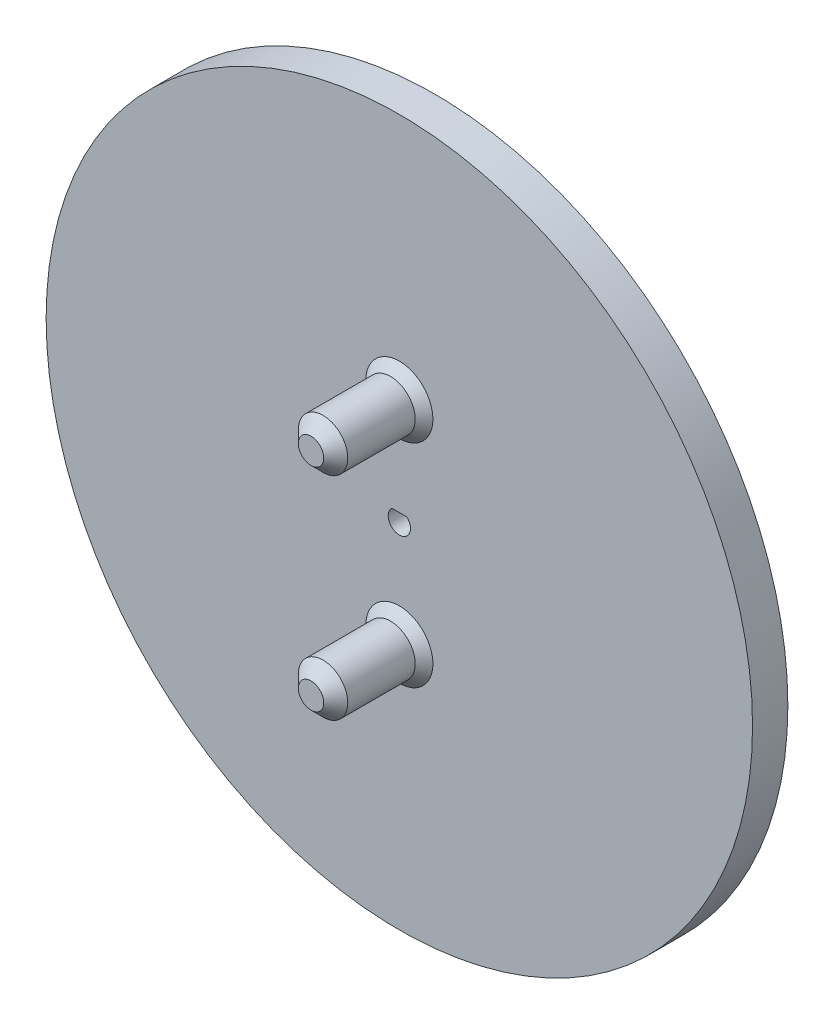
ISO-10303-21;
HEADER;
FILE_DESCRIPTION(('STEP AP214'),'2;1');
FILE_NAME('part.step','',(''),(''),'','','');
FILE_SCHEMA(('AUTOMOTIVE_DESIGN { 1 0 10303 214 1 1 1 1 }'));
ENDSEC;
DATA;
#1=APPLICATION_CONTEXT('core data for automotive mechanical design processes');
#2=APPLICATION_PROTOCOL_DEFINITION('international standard','automotive_design',2000,#1);
#3=PRODUCT_CONTEXT('',#1,'mechanical');
#4=PRODUCT('Part','Part','',(#3));
#5=PRODUCT_RELATED_PRODUCT_CATEGORY('part','',(#4));
#6=PRODUCT_DEFINITION_FORMATION('','',#4);
#7=PRODUCT_DEFINITION_CONTEXT('part definition',#1,'design');
#8=PRODUCT_DEFINITION('design','',#6,#7);
#9=PRODUCT_DEFINITION_SHAPE('','',#8);
#10=(LENGTH_UNIT() NAMED_UNIT(*) SI_UNIT(.MILLI.,.METRE.));
#11=(NAMED_UNIT(*) PLANE_ANGLE_UNIT() SI_UNIT($,.RADIAN.));
#12=(NAMED_UNIT(*) SI_UNIT($,.STERADIAN.) SOLID_ANGLE_UNIT());
#13=UNCERTAINTY_MEASURE_WITH_UNIT(LENGTH_MEASURE(1.E-05),#10,'distance_accuracy_value','');
#14=(GEOMETRIC_REPRESENTATION_CONTEXT(3) GLOBAL_UNCERTAINTY_ASSIGNED_CONTEXT((#13)) GLOBAL_UNIT_ASSIGNED_CONTEXT((#10,
#11,#12)) REPRESENTATION_CONTEXT('',''));
#15=CARTESIAN_POINT('',(0.,0.,0.));
#16=DIRECTION('',(0.,0.,1.));
#17=DIRECTION('',(1.,0.,0.));
#18=AXIS2_PLACEMENT_3D('',#15,#16,#17);
#19=CARTESIAN_POINT('',(0.,0.,6.35));
#20=DIRECTION('',(0.,0.,-1.));
#21=DIRECTION('',(-1.,0.,0.));
#22=AXIS2_PLACEMENT_3D('',#19,#20,#21);
#23=CYLINDRICAL_SURFACE('',#22,63.5);
#24=CARTESIAN_POINT('',(0.,0.,6.35));
#25=DIRECTION('',(0.,0.,1.));
#26=DIRECTION('',(1.,0.,0.));
#27=AXIS2_PLACEMENT_3D('',#24,#25,#26);
#28=CIRCLE('',#27,63.5);
#29=CARTESIAN_POINT('',(63.5,0.,6.35));
#30=VERTEX_POINT('',#29);
#31=EDGE_CURVE('E88',#30,#30,#28,.T.);
#32=ORIENTED_EDGE('',*,*,#31,.F.);
#33=EDGE_LOOP('',(#32));
#34=FACE_BOUND('',#33,.T.);
#35=CARTESIAN_POINT('',(0.,0.,0.));
#36=DIRECTION('',(0.,0.,1.));
#37=DIRECTION('',(1.,0.,0.));
#38=AXIS2_PLACEMENT_3D('',#35,#36,#37);
#39=CIRCLE('',#38,63.5);
#40=CARTESIAN_POINT('',(63.5,0.,0.));
#41=VERTEX_POINT('',#40);
#42=EDGE_CURVE('E72',#41,#41,#39,.T.);
#43=ORIENTED_EDGE('',*,*,#42,.T.);
#44=EDGE_LOOP('',(#43));
#45=FACE_BOUND('',#44,.T.);
#46=ADVANCED_FACE('F40',(#34,#45),#23,.T.);
#47=CARTESIAN_POINT('',(0.,0.,6.35));
#48=DIRECTION('',(0.,0.,1.));
#49=DIRECTION('',(1.,0.,0.));
#50=AXIS2_PLACEMENT_3D('',#47,#48,#49);
#51=PLANE('',#50);
#52=CARTESIAN_POINT('',(0.,-19.05,6.35));
#53=DIRECTION('',(0.,0.,1.));
#54=DIRECTION('',(1.,0.,0.));
#55=AXIS2_PLACEMENT_3D('',#52,#53,#54);
#56=CIRCLE('',#55,6.03249999999997);
#57=CARTESIAN_POINT('',(-6.03249999999997,-19.05,6.35));
#58=VERTEX_POINT('',#57);
#59=EDGE_CURVE('E49',#58,#58,#56,.F.);
#60=ORIENTED_EDGE('',*,*,#59,.T.);
#61=EDGE_LOOP('',(#60));
#62=FACE_BOUND('',#61,.T.);
#63=CARTESIAN_POINT('',(0.,19.05,6.35));
#64=DIRECTION('',(0.,0.,1.));
#65=DIRECTION('',(1.,0.,0.));
#66=AXIS2_PLACEMENT_3D('',#63,#64,#65);
#67=CIRCLE('',#66,6.03249999999997);
#68=CARTESIAN_POINT('',(-6.03249999999997,19.05,6.35));
#69=VERTEX_POINT('',#68);
#70=EDGE_CURVE('E108',#69,#69,#67,.F.);
#71=ORIENTED_EDGE('',*,*,#70,.T.);
#72=EDGE_LOOP('',(#71));
#73=FACE_BOUND('',#72,.T.);
#74=CARTESIAN_POINT('',(0.,0.,6.35));
#75=DIRECTION('',(0.,0.,1.));
#76=DIRECTION('',(1.,0.,0.));
#77=AXIS2_PLACEMENT_3D('',#74,#75,#76);
#78=CIRCLE('',#77,2.);
#79=CARTESIAN_POINT('',(-1.3228756555323,1.5,6.35));
#80=VERTEX_POINT('',#79);
#81=CARTESIAN_POINT('',(1.3228756555323,1.5,6.35));
#82=VERTEX_POINT('',#81);
#83=EDGE_CURVE('E56',#80,#82,#78,.T.);
#84=ORIENTED_EDGE('',*,*,#83,.F.);
#85=DIRECTION('',(-1.,0.,0.));
#86=VECTOR('',#85,1.);
#87=CARTESIAN_POINT('',(-1.3228756555323,1.5,6.35));
#88=LINE('',#87,#86);
#89=EDGE_CURVE('E76',#82,#80,#88,.T.);
#90=ORIENTED_EDGE('',*,*,#89,.F.);
#91=EDGE_LOOP('',(#84,#90));
#92=FACE_BOUND('',#91,.T.);
#93=ORIENTED_EDGE('',*,*,#31,.T.);
#94=EDGE_LOOP('',(#93));
#95=FACE_BOUND('',#94,.T.);
#96=ADVANCED_FACE('F80',(#62,#73,#92,#95),#51,.T.);
#97=CARTESIAN_POINT('',(0.,0.,0.));
#98=DIRECTION('',(0.,0.,1.));
#99=DIRECTION('',(1.,0.,0.));
#100=AXIS2_PLACEMENT_3D('',#97,#98,#99);
#101=PLANE('',#100);
#102=DIRECTION('',(-1.,0.,0.));
#103=VECTOR('',#102,1.);
#104=CARTESIAN_POINT('',(-1.3228756555323,1.5,0.));
#105=LINE('',#104,#103);
#106=CARTESIAN_POINT('',(1.3228756555323,1.5,0.));
#107=VERTEX_POINT('',#106);
#108=CARTESIAN_POINT('',(-1.3228756555323,1.5,0.));
#109=VERTEX_POINT('',#108);
#110=EDGE_CURVE('E84',#107,#109,#105,.T.);
#111=ORIENTED_EDGE('',*,*,#110,.T.);
#112=CARTESIAN_POINT('',(0.,0.,0.));
#113=DIRECTION('',(0.,0.,1.));
#114=DIRECTION('',(1.,0.,0.));
#115=AXIS2_PLACEMENT_3D('',#112,#113,#114);
#116=CIRCLE('',#115,2.);
#117=EDGE_CURVE('E61',#109,#107,#116,.T.);
#118=ORIENTED_EDGE('',*,*,#117,.T.);
#119=EDGE_LOOP('',(#111,#118));
#120=FACE_BOUND('',#119,.T.);
#121=ORIENTED_EDGE('',*,*,#42,.F.);
#122=EDGE_LOOP('',(#121));
#123=FACE_BOUND('',#122,.T.);
#124=ADVANCED_FACE('F149',(#120,#123),#101,.F.);
#125=CARTESIAN_POINT('',(0.,0.,0.));
#126=DIRECTION('',(0.,0.,1.));
#127=DIRECTION('',(1.,0.,0.));
#128=AXIS2_PLACEMENT_3D('',#125,#126,#127);
#129=CYLINDRICAL_SURFACE('',#128,2.);
#130=ORIENTED_EDGE('',*,*,#83,.T.);
#131=DIRECTION('',(0.,0.,1.));
#132=VECTOR('',#131,1.);
#133=CARTESIAN_POINT('',(1.3228756555323,1.5,0.));
#134=LINE('',#133,#132);
#135=EDGE_CURVE('E73',#107,#82,#134,.T.);
#136=ORIENTED_EDGE('',*,*,#135,.F.);
#137=ORIENTED_EDGE('',*,*,#117,.F.);
#138=DIRECTION('',(0.,0.,1.));
#139=VECTOR('',#138,1.);
#140=CARTESIAN_POINT('',(-1.3228756555323,1.5,0.));
#141=LINE('',#140,#139);
#142=EDGE_CURVE('E66',#109,#80,#141,.T.);
#143=ORIENTED_EDGE('',*,*,#142,.T.);
#144=EDGE_LOOP('',(#130,#136,#137,#143));
#145=FACE_BOUND('',#144,.T.);
#146=ADVANCED_FACE('F68',(#145),#129,.F.);
#147=CARTESIAN_POINT('',(-1.3228756555323,1.5,0.));
#148=DIRECTION('',(0.,1.,0.));
#149=DIRECTION('',(0.,0.,1.));
#150=AXIS2_PLACEMENT_3D('',#147,#148,#149);
#151=PLANE('',#150);
#152=ORIENTED_EDGE('',*,*,#89,.T.);
#153=ORIENTED_EDGE('',*,*,#142,.F.);
#154=ORIENTED_EDGE('',*,*,#110,.F.);
#155=ORIENTED_EDGE('',*,*,#135,.T.);
#156=EDGE_LOOP('',(#152,#153,#154,#155));
#157=FACE_BOUND('',#156,.T.);
#158=ADVANCED_FACE('F77',(#157),#151,.F.);
#159=CARTESIAN_POINT('',(0.,19.05,22.225));
#160=DIRECTION('',(0.,0.,-1.));
#161=DIRECTION('',(-1.,0.,0.));
#162=AXIS2_PLACEMENT_3D('',#159,#160,#161);
#163=CYLINDRICAL_SURFACE('',#162,4.445);
#164=CARTESIAN_POINT('',(0.,19.05,7.93750000000001));
#165=DIRECTION('',(0.,0.,1.));
#166=DIRECTION('',(1.,0.,0.));
#167=AXIS2_PLACEMENT_3D('',#164,#165,#166);
#168=CIRCLE('',#167,4.445);
#169=CARTESIAN_POINT('',(-4.445,19.05,7.93750000000001));
#170=VERTEX_POINT('',#169);
#171=EDGE_CURVE('E11',#170,#170,#168,.T.);
#172=ORIENTED_EDGE('',*,*,#171,.T.);
#173=EDGE_LOOP('',(#172));
#174=FACE_BOUND('',#173,.T.);
#175=CARTESIAN_POINT('',(0.,19.05,20.0660000000001));
#176=DIRECTION('',(0.,0.,1.));
#177=DIRECTION('',(1.,0.,0.));
#178=AXIS2_PLACEMENT_3D('',#175,#176,#177);
#179=CIRCLE('',#178,4.445);
#180=CARTESIAN_POINT('',(4.445,19.05,20.0660000000001));
#181=VERTEX_POINT('',#180);
#182=EDGE_CURVE('E102',#181,#181,#179,.F.);
#183=ORIENTED_EDGE('',*,*,#182,.T.);
#184=EDGE_LOOP('',(#183));
#185=FACE_BOUND('',#184,.T.);
#186=ADVANCED_FACE('F161',(#174,#185),#163,.T.);
#187=CARTESIAN_POINT('',(0.,19.05,22.225));
#188=DIRECTION('',(0.,0.,1.));
#189=DIRECTION('',(1.,0.,0.));
#190=AXIS2_PLACEMENT_3D('',#187,#188,#189);
#191=PLANE('',#190);
#192=CARTESIAN_POINT('',(0.,19.05,22.225));
#193=DIRECTION('',(0.,0.,1.));
#194=DIRECTION('',(1.,0.,0.));
#195=AXIS2_PLACEMENT_3D('',#192,#193,#194);
#196=CIRCLE('',#195,2.28600000000007);
#197=CARTESIAN_POINT('',(2.28600000000007,19.05,22.225));
#198=VERTEX_POINT('',#197);
#199=EDGE_CURVE('E99',#198,#198,#196,.T.);
#200=ORIENTED_EDGE('',*,*,#199,.T.);
#201=EDGE_LOOP('',(#200));
#202=FACE_BOUND('',#201,.T.);
#203=ADVANCED_FACE('F125',(#202),#191,.T.);
#204=CARTESIAN_POINT('',(0.,-19.05,22.225));
#205=DIRECTION('',(0.,0.,-1.));
#206=DIRECTION('',(-1.,0.,0.));
#207=AXIS2_PLACEMENT_3D('',#204,#205,#206);
#208=CYLINDRICAL_SURFACE('',#207,4.445);
#209=CARTESIAN_POINT('',(0.,-19.05,7.93750000000001));
#210=DIRECTION('',(0.,0.,1.));
#211=DIRECTION('',(1.,0.,0.));
#212=AXIS2_PLACEMENT_3D('',#209,#210,#211);
#213=CIRCLE('',#212,4.445);
#214=CARTESIAN_POINT('',(-4.445,-19.05,7.93750000000001));
#215=VERTEX_POINT('',#214);
#216=EDGE_CURVE('E105',#215,#215,#213,.T.);
#217=ORIENTED_EDGE('',*,*,#216,.T.);
#218=EDGE_LOOP('',(#217));
#219=FACE_BOUND('',#218,.T.);
#220=CARTESIAN_POINT('',(0.,-19.05,20.066));
#221=DIRECTION('',(0.,0.,1.));
#222=DIRECTION('',(1.,0.,0.));
#223=AXIS2_PLACEMENT_3D('',#220,#221,#222);
#224=CIRCLE('',#223,4.445);
#225=CARTESIAN_POINT('',(4.445,-19.05,20.066));
#226=VERTEX_POINT('',#225);
#227=EDGE_CURVE('E91',#226,#226,#224,.F.);
#228=ORIENTED_EDGE('',*,*,#227,.T.);
#229=EDGE_LOOP('',(#228));
#230=FACE_BOUND('',#229,.T.);
#231=ADVANCED_FACE('F121',(#219,#230),#208,.T.);
#232=CARTESIAN_POINT('',(0.,-19.05,22.225));
#233=DIRECTION('',(0.,0.,1.));
#234=DIRECTION('',(1.,0.,0.));
#235=AXIS2_PLACEMENT_3D('',#232,#233,#234);
#236=PLANE('',#235);
#237=CARTESIAN_POINT('',(0.,-19.05,22.225));
#238=DIRECTION('',(0.,0.,1.));
#239=DIRECTION('',(1.,0.,0.));
#240=AXIS2_PLACEMENT_3D('',#237,#238,#239);
#241=CIRCLE('',#240,2.28600000000001);
#242=CARTESIAN_POINT('',(2.28600000000001,-19.05,22.225));
#243=VERTEX_POINT('',#242);
#244=EDGE_CURVE('E96',#243,#243,#241,.T.);
#245=ORIENTED_EDGE('',*,*,#244,.T.);
#246=EDGE_LOOP('',(#245));
#247=FACE_BOUND('',#246,.T.);
#248=ADVANCED_FACE('F124',(#247),#236,.T.);
#249=CARTESIAN_POINT('',(0.,-19.05,20.066));
#250=DIRECTION('',(0.,0.,-1.));
#251=DIRECTION('',(-1.,0.,0.));
#252=AXIS2_PLACEMENT_3D('',#249,#250,#251);
#253=CONICAL_SURFACE('',#252,4.445,0.785398163397445);
#254=ORIENTED_EDGE('',*,*,#244,.F.);
#255=EDGE_LOOP('',(#254));
#256=FACE_BOUND('',#255,.T.);
#257=ORIENTED_EDGE('',*,*,#227,.F.);
#258=EDGE_LOOP('',(#257));
#259=FACE_BOUND('',#258,.T.);
#260=ADVANCED_FACE('F129',(#256,#259),#253,.T.);
#261=CARTESIAN_POINT('',(0.,19.05,22.225));
#262=DIRECTION('',(0.,0.,-1.));
#263=DIRECTION('',(-1.,0.,0.));
#264=AXIS2_PLACEMENT_3D('',#261,#262,#263);
#265=CONICAL_SURFACE('',#264,2.28600000000007,0.785398163397445);
#266=ORIENTED_EDGE('',*,*,#182,.F.);
#267=EDGE_LOOP('',(#266));
#268=FACE_BOUND('',#267,.T.);
#269=ORIENTED_EDGE('',*,*,#199,.F.);
#270=EDGE_LOOP('',(#269));
#271=FACE_BOUND('',#270,.T.);
#272=ADVANCED_FACE('F118',(#268,#271),#265,.T.);
#273=CARTESIAN_POINT('',(0.,-19.05,7.93750000000001));
#274=DIRECTION('',(0.,0.,-1.));
#275=DIRECTION('',(-1.,0.,0.));
#276=AXIS2_PLACEMENT_3D('',#273,#274,#275);
#277=CONICAL_SURFACE('',#276,4.445,0.785398163397437);
#278=CARTESIAN_POINT('',(-6.03249999999997,-19.05,6.35));
#279=CARTESIAN_POINT('',(-6.01596354166664,-19.05,6.36653645833333));
#280=CARTESIAN_POINT('',(-5.99942708333331,-19.05,6.38307291666667));
#281=CARTESIAN_POINT('',(-5.96635416666664,-19.05,6.41614583333333));
#282=CARTESIAN_POINT('',(-5.94981770833331,-19.05,6.43268229166667));
#283=CARTESIAN_POINT('',(-5.91674479166664,-19.05,6.46575520833333));
#284=CARTESIAN_POINT('',(-5.90020833333331,-19.05,6.48229166666667));
#285=CARTESIAN_POINT('',(-5.86713541666664,-19.05,6.51536458333333));
#286=CARTESIAN_POINT('',(-5.85059895833331,-19.05,6.53190104166667));
#287=CARTESIAN_POINT('',(-5.81752604166664,-19.05,6.56497395833333));
#288=CARTESIAN_POINT('',(-5.80098958333331,-19.05,6.58151041666667));
#289=CARTESIAN_POINT('',(-5.76791666666664,-19.05,6.61458333333333));
#290=CARTESIAN_POINT('',(-5.75138020833331,-19.05,6.63111979166667));
#291=CARTESIAN_POINT('',(-5.71830729166664,-19.05,6.66419270833333));
#292=CARTESIAN_POINT('',(-5.70177083333331,-19.05,6.68072916666667));
#293=CARTESIAN_POINT('',(-5.66869791666664,-19.05,6.71380208333333));
#294=CARTESIAN_POINT('',(-5.65216145833331,-19.05,6.73033854166667));
#295=CARTESIAN_POINT('',(-5.61908854166665,-19.05,6.76341145833333));
#296=CARTESIAN_POINT('',(-5.60255208333331,-19.05,6.77994791666667));
#297=CARTESIAN_POINT('',(-5.56947916666665,-19.05,6.81302083333333));
#298=CARTESIAN_POINT('',(-5.55294270833331,-19.05,6.82955729166667));
#299=CARTESIAN_POINT('',(-5.51986979166665,-19.05,6.86263020833333));
#300=CARTESIAN_POINT('',(-5.50333333333331,-19.05,6.87916666666667));
#301=CARTESIAN_POINT('',(-5.47026041666665,-19.05,6.91223958333333));
#302=CARTESIAN_POINT('',(-5.45372395833332,-19.05,6.92877604166667));
#303=CARTESIAN_POINT('',(-5.42065104166665,-19.05,6.96184895833334));
#304=CARTESIAN_POINT('',(-5.40411458333332,-19.05,6.97838541666667));
#305=CARTESIAN_POINT('',(-5.37104166666665,-19.05,7.01145833333333));
#306=CARTESIAN_POINT('',(-5.35450520833332,-19.05,7.02799479166667));
#307=CARTESIAN_POINT('',(-5.32143229166665,-19.05,7.06106770833334));
#308=CARTESIAN_POINT('',(-5.30489583333332,-19.05,7.07760416666667));
#309=CARTESIAN_POINT('',(-5.27182291666665,-19.05,7.11067708333334));
#310=CARTESIAN_POINT('',(-5.25528645833332,-19.05,7.12721354166667));
#311=CARTESIAN_POINT('',(-5.22221354166665,-19.05,7.16028645833334));
#312=CARTESIAN_POINT('',(-5.20567708333332,-19.05,7.17682291666667));
#313=CARTESIAN_POINT('',(-5.17260416666665,-19.05,7.20989583333334));
#314=CARTESIAN_POINT('',(-5.15606770833332,-19.05,7.22643229166667));
#315=CARTESIAN_POINT('',(-5.12299479166665,-19.05,7.25950520833334));
#316=CARTESIAN_POINT('',(-5.10645833333332,-19.05,7.27604166666667));
#317=CARTESIAN_POINT('',(-5.07338541666665,-19.05,7.30911458333334));
#318=CARTESIAN_POINT('',(-5.05684895833332,-19.05,7.32565104166667));
#319=CARTESIAN_POINT('',(-5.02377604166666,-19.05,7.35872395833334));
#320=CARTESIAN_POINT('',(-5.00723958333332,-19.05,7.37526041666667));
#321=CARTESIAN_POINT('',(-4.97416666666666,-19.05,7.40833333333334));
#322=CARTESIAN_POINT('',(-4.95763020833332,-19.05,7.42486979166667));
#323=CARTESIAN_POINT('',(-4.92455729166666,-19.05,7.45794270833334));
#324=CARTESIAN_POINT('',(-4.90802083333332,-19.05,7.47447916666667));
#325=CARTESIAN_POINT('',(-4.87494791666666,-19.05,7.50755208333334));
#326=CARTESIAN_POINT('',(-4.85841145833333,-19.05,7.52408854166667));
#327=CARTESIAN_POINT('',(-4.82533854166666,-19.05,7.55716145833334));
#328=CARTESIAN_POINT('',(-4.80880208333333,-19.05,7.57369791666667));
#329=CARTESIAN_POINT('',(-4.77572916666666,-19.05,7.60677083333334));
#330=CARTESIAN_POINT('',(-4.75919270833333,-19.05,7.62330729166667));
#331=CARTESIAN_POINT('',(-4.72611979166666,-19.05,7.65638020833334));
#332=CARTESIAN_POINT('',(-4.70958333333333,-19.05,7.67291666666667));
#333=CARTESIAN_POINT('',(-4.67651041666666,-19.05,7.70598958333334));
#334=CARTESIAN_POINT('',(-4.65997395833333,-19.05,7.72252604166667));
#335=CARTESIAN_POINT('',(-4.62690104166666,-19.05,7.75559895833334));
#336=CARTESIAN_POINT('',(-4.61036458333333,-19.05,7.77213541666667));
#337=CARTESIAN_POINT('',(-4.57729166666666,-19.05,7.80520833333334));
#338=CARTESIAN_POINT('',(-4.56075520833333,-19.05,7.82174479166667));
#339=CARTESIAN_POINT('',(-4.52768229166666,-19.05,7.85481770833334));
#340=CARTESIAN_POINT('',(-4.51114583333333,-19.05,7.87135416666667));
#341=CARTESIAN_POINT('',(-4.47807291666667,-19.05,7.90442708333334));
#342=CARTESIAN_POINT('',(-4.46153645833333,-19.05,7.92096354166667));
#343=CARTESIAN_POINT('',(-4.445,-19.05,7.93750000000001));
#344=B_SPLINE_CURVE_WITH_KNOTS('',3,(#278,#279,#280,#281,#282,#283,#284,#285,#286,#287,#288,
#289,#290,#291,#292,#293,#294,#295,#296,#297,#298,#299,#300,#301,#302,#303,#304,#305,#306,#307,
#308,#309,#310,#311,#312,#313,#314,#315,#316,#317,#318,#319,#320,#321,#322,#323,#324,#325,#326,
#327,#328,#329,#330,#331,#332,#333,#334,#335,#336,#337,#338,#339,#340,#341,#342,#343),
.UNSPECIFIED.,.F.,.F.,(4,2,2,2,2,2,2,2,2,2,2,2,2,2,2,2,2,2,2,2,2,2,2,2,2,2,2,2,2,2,2,2,4),(0.,
0.0701582509458524,0.140316501891704,0.210474752837557,0.28063300378341,0.350791254729261,
0.420949505675114,0.491107756620966,0.561266007566819,0.63142425851267,0.701582509458523,
0.771740760404375,0.841899011350227,0.912057262296079,0.982215513241932,1.05237376418778,
1.12253201513364,1.19269026607949,1.26284851702534,1.33300676797119,1.40316501891705,
1.4733232698629,1.54348152080875,1.6136397717546,1.68379802270046,1.75395627364631,
1.82411452459216,1.89427277553801,1.96443102648386,2.03458927742972,2.10474752837557,
2.17490577932142,2.24506403026727),.UNSPECIFIED.);
#345=EDGE_CURVE('BSEAM115',#58,#215,#344,.T.);
#346=ORIENTED_EDGE('',*,*,#59,.F.);
#347=ORIENTED_EDGE('',*,*,#216,.F.);
#348=ORIENTED_EDGE('',*,*,#345,.T.);
#349=ORIENTED_EDGE('',*,*,#345,.F.);
#350=EDGE_LOOP('',(#346,#348,#347,#349));
#351=FACE_BOUND('',#350,.T.);
#352=ADVANCED_FACE('F115',(#351),#277,.T.);
#353=CARTESIAN_POINT('',(0.,19.05,7.93750000000001));
#354=DIRECTION('',(0.,0.,-1.));
#355=DIRECTION('',(-1.,0.,0.));
#356=AXIS2_PLACEMENT_3D('',#353,#354,#355);
#357=CONICAL_SURFACE('',#356,4.445,0.785398163397437);
#358=CARTESIAN_POINT('',(-6.03249999999997,19.05,6.35));
#359=CARTESIAN_POINT('',(-6.01596354166664,19.05,6.36653645833333));
#360=CARTESIAN_POINT('',(-5.99942708333331,19.05,6.38307291666667));
#361=CARTESIAN_POINT('',(-5.96635416666664,19.05,6.41614583333333));
#362=CARTESIAN_POINT('',(-5.94981770833331,19.05,6.43268229166667));
#363=CARTESIAN_POINT('',(-5.91674479166664,19.05,6.46575520833333));
#364=CARTESIAN_POINT('',(-5.90020833333331,19.05,6.48229166666667));
#365=CARTESIAN_POINT('',(-5.86713541666664,19.05,6.51536458333333));
#366=CARTESIAN_POINT('',(-5.85059895833331,19.05,6.53190104166667));
#367=CARTESIAN_POINT('',(-5.81752604166664,19.05,6.56497395833333));
#368=CARTESIAN_POINT('',(-5.80098958333331,19.05,6.58151041666667));
#369=CARTESIAN_POINT('',(-5.76791666666664,19.05,6.61458333333333));
#370=CARTESIAN_POINT('',(-5.75138020833331,19.05,6.63111979166667));
#371=CARTESIAN_POINT('',(-5.71830729166664,19.05,6.66419270833333));
#372=CARTESIAN_POINT('',(-5.70177083333331,19.05,6.68072916666667));
#373=CARTESIAN_POINT('',(-5.66869791666664,19.05,6.71380208333333));
#374=CARTESIAN_POINT('',(-5.65216145833331,19.05,6.73033854166667));
#375=CARTESIAN_POINT('',(-5.61908854166665,19.05,6.76341145833333));
#376=CARTESIAN_POINT('',(-5.60255208333331,19.05,6.77994791666667));
#377=CARTESIAN_POINT('',(-5.56947916666665,19.05,6.81302083333333));
#378=CARTESIAN_POINT('',(-5.55294270833331,19.05,6.82955729166667));
#379=CARTESIAN_POINT('',(-5.51986979166665,19.05,6.86263020833333));
#380=CARTESIAN_POINT('',(-5.50333333333331,19.05,6.87916666666667));
#381=CARTESIAN_POINT('',(-5.47026041666665,19.05,6.91223958333333));
#382=CARTESIAN_POINT('',(-5.45372395833332,19.05,6.92877604166667));
#383=CARTESIAN_POINT('',(-5.42065104166665,19.05,6.96184895833334));
#384=CARTESIAN_POINT('',(-5.40411458333332,19.05,6.97838541666667));
#385=CARTESIAN_POINT('',(-5.37104166666665,19.05,7.01145833333333));
#386=CARTESIAN_POINT('',(-5.35450520833332,19.05,7.02799479166667));
#387=CARTESIAN_POINT('',(-5.32143229166665,19.05,7.06106770833334));
#388=CARTESIAN_POINT('',(-5.30489583333332,19.05,7.07760416666667));
#389=CARTESIAN_POINT('',(-5.27182291666665,19.05,7.11067708333334));
#390=CARTESIAN_POINT('',(-5.25528645833332,19.05,7.12721354166667));
#391=CARTESIAN_POINT('',(-5.22221354166665,19.05,7.16028645833334));
#392=CARTESIAN_POINT('',(-5.20567708333332,19.05,7.17682291666667));
#393=CARTESIAN_POINT('',(-5.17260416666665,19.05,7.20989583333334));
#394=CARTESIAN_POINT('',(-5.15606770833332,19.05,7.22643229166667));
#395=CARTESIAN_POINT('',(-5.12299479166665,19.05,7.25950520833334));
#396=CARTESIAN_POINT('',(-5.10645833333332,19.05,7.27604166666667));
#397=CARTESIAN_POINT('',(-5.07338541666665,19.05,7.30911458333334));
#398=CARTESIAN_POINT('',(-5.05684895833332,19.05,7.32565104166667));
#399=CARTESIAN_POINT('',(-5.02377604166666,19.05,7.35872395833334));
#400=CARTESIAN_POINT('',(-5.00723958333332,19.05,7.37526041666667));
#401=CARTESIAN_POINT('',(-4.97416666666666,19.05,7.40833333333334));
#402=CARTESIAN_POINT('',(-4.95763020833332,19.05,7.42486979166667));
#403=CARTESIAN_POINT('',(-4.92455729166666,19.05,7.45794270833334));
#404=CARTESIAN_POINT('',(-4.90802083333332,19.05,7.47447916666667));
#405=CARTESIAN_POINT('',(-4.87494791666666,19.05,7.50755208333334));
#406=CARTESIAN_POINT('',(-4.85841145833333,19.05,7.52408854166667));
#407=CARTESIAN_POINT('',(-4.82533854166666,19.05,7.55716145833334));
#408=CARTESIAN_POINT('',(-4.80880208333333,19.05,7.57369791666667));
#409=CARTESIAN_POINT('',(-4.77572916666666,19.05,7.60677083333334));
#410=CARTESIAN_POINT('',(-4.75919270833333,19.05,7.62330729166667));
#411=CARTESIAN_POINT('',(-4.72611979166666,19.05,7.65638020833334));
#412=CARTESIAN_POINT('',(-4.70958333333333,19.05,7.67291666666667));
#413=CARTESIAN_POINT('',(-4.67651041666666,19.05,7.70598958333334));
#414=CARTESIAN_POINT('',(-4.65997395833333,19.05,7.72252604166667));
#415=CARTESIAN_POINT('',(-4.62690104166666,19.05,7.75559895833334));
#416=CARTESIAN_POINT('',(-4.61036458333333,19.05,7.77213541666667));
#417=CARTESIAN_POINT('',(-4.57729166666666,19.05,7.80520833333334));
#418=CARTESIAN_POINT('',(-4.56075520833333,19.05,7.82174479166667));
#419=CARTESIAN_POINT('',(-4.52768229166666,19.05,7.85481770833334));
#420=CARTESIAN_POINT('',(-4.51114583333333,19.05,7.87135416666667));
#421=CARTESIAN_POINT('',(-4.47807291666667,19.05,7.90442708333334));
#422=CARTESIAN_POINT('',(-4.46153645833333,19.05,7.92096354166667));
#423=CARTESIAN_POINT('',(-4.445,19.05,7.93750000000001));
#424=B_SPLINE_CURVE_WITH_KNOTS('',3,(#358,#359,#360,#361,#362,#363,#364,#365,#366,#367,#368,
#369,#370,#371,#372,#373,#374,#375,#376,#377,#378,#379,#380,#381,#382,#383,#384,#385,#386,#387,
#388,#389,#390,#391,#392,#393,#394,#395,#396,#397,#398,#399,#400,#401,#402,#403,#404,#405,#406,
#407,#408,#409,#410,#411,#412,#413,#414,#415,#416,#417,#418,#419,#420,#421,#422,#423),
.UNSPECIFIED.,.F.,.F.,(4,2,2,2,2,2,2,2,2,2,2,2,2,2,2,2,2,2,2,2,2,2,2,2,2,2,2,2,2,2,2,2,4),(0.,
0.0701582509458524,0.140316501891704,0.210474752837557,0.28063300378341,0.350791254729261,
0.420949505675114,0.491107756620966,0.561266007566819,0.63142425851267,0.701582509458523,
0.771740760404375,0.841899011350227,0.912057262296079,0.982215513241932,1.05237376418778,
1.12253201513364,1.19269026607949,1.26284851702534,1.33300676797119,1.40316501891705,
1.4733232698629,1.54348152080875,1.6136397717546,1.68379802270046,1.75395627364631,
1.82411452459216,1.89427277553801,1.96443102648386,2.03458927742972,2.10474752837557,
2.17490577932142,2.24506403026727),.UNSPECIFIED.);
#425=EDGE_CURVE('BSEAM43',#69,#170,#424,.T.);
#426=ORIENTED_EDGE('',*,*,#70,.F.);
#427=ORIENTED_EDGE('',*,*,#171,.F.);
#428=ORIENTED_EDGE('',*,*,#425,.T.);
#429=ORIENTED_EDGE('',*,*,#425,.F.);
#430=EDGE_LOOP('',(#426,#428,#427,#429));
#431=FACE_BOUND('',#430,.T.);
#432=ADVANCED_FACE('F43',(#431),#357,.T.);
#433=CLOSED_SHELL('',(#46,#96,#124,#146,#158,#186,#203,#231,#248,#260,#272,#352,#432));
#434=MANIFOLD_SOLID_BREP('B2',#433);
#435=ADVANCED_BREP_SHAPE_REPRESENTATION('',(#18,#434),#14);
#436=SHAPE_DEFINITION_REPRESENTATION(#9,#435);
ENDSEC;
END-ISO-10303-21;
